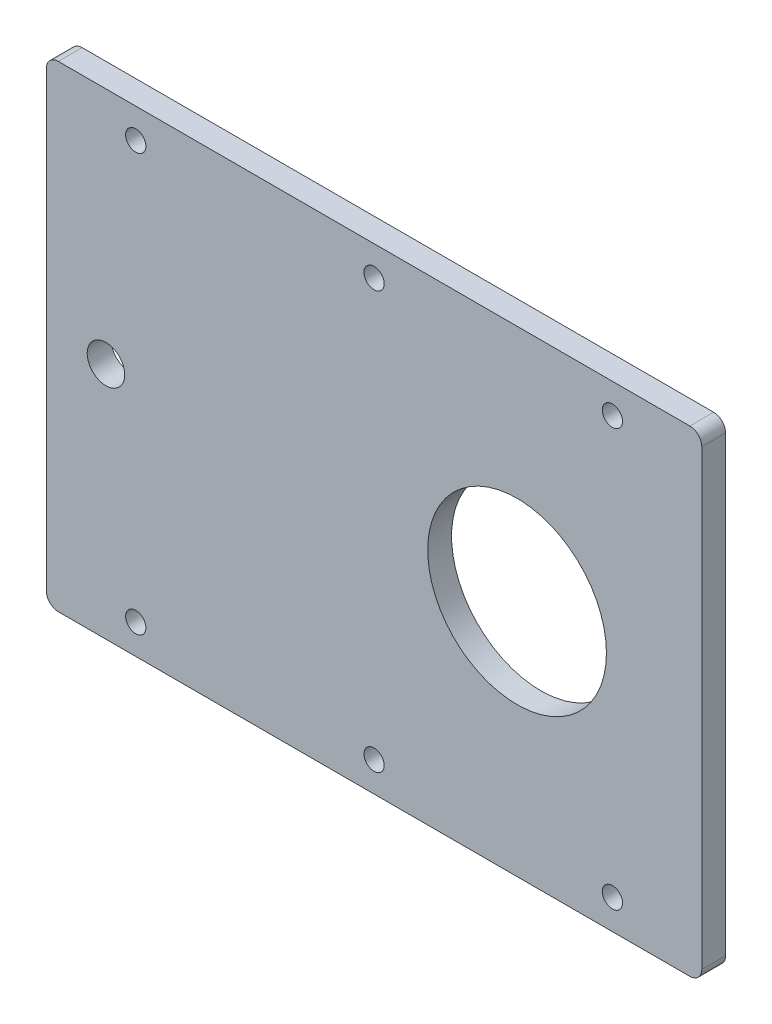
ISO-10303-21;
HEADER;
FILE_DESCRIPTION(('STEP AP214'),'2;1');
FILE_NAME('part.step','',(''),(''),'','','');
FILE_SCHEMA(('AUTOMOTIVE_DESIGN { 1 0 10303 214 1 1 1 1 }'));
ENDSEC;
DATA;
#1=APPLICATION_CONTEXT('core data for automotive mechanical design processes');
#2=APPLICATION_PROTOCOL_DEFINITION('international standard','automotive_design',2000,#1);
#3=PRODUCT_CONTEXT('',#1,'mechanical');
#4=PRODUCT('Part','Part','',(#3));
#5=PRODUCT_RELATED_PRODUCT_CATEGORY('part','',(#4));
#6=PRODUCT_DEFINITION_FORMATION('','',#4);
#7=PRODUCT_DEFINITION_CONTEXT('part definition',#1,'design');
#8=PRODUCT_DEFINITION('design','',#6,#7);
#9=PRODUCT_DEFINITION_SHAPE('','',#8);
#10=(LENGTH_UNIT() NAMED_UNIT(*) SI_UNIT(.MILLI.,.METRE.));
#11=(NAMED_UNIT(*) PLANE_ANGLE_UNIT() SI_UNIT($,.RADIAN.));
#12=(NAMED_UNIT(*) SI_UNIT($,.STERADIAN.) SOLID_ANGLE_UNIT());
#13=UNCERTAINTY_MEASURE_WITH_UNIT(LENGTH_MEASURE(1.E-05),#10,'distance_accuracy_value','');
#14=(GEOMETRIC_REPRESENTATION_CONTEXT(3) GLOBAL_UNCERTAINTY_ASSIGNED_CONTEXT((#13)) GLOBAL_UNIT_ASSIGNED_CONTEXT((#10,
#11,#12)) REPRESENTATION_CONTEXT('',''));
#15=CARTESIAN_POINT('',(0.,0.,0.));
#16=DIRECTION('',(0.,0.,1.));
#17=DIRECTION('',(1.,0.,0.));
#18=AXIS2_PLACEMENT_3D('',#15,#16,#17);
#19=CARTESIAN_POINT('',(108.890553518469,0.,4.));
#20=DIRECTION('',(1.,0.,0.));
#21=DIRECTION('',(0.,0.,-1.));
#22=AXIS2_PLACEMENT_3D('',#19,#20,#21);
#23=PLANE('',#22);
#24=DIRECTION('',(0.,-1.,0.));
#25=VECTOR('',#24,1.);
#26=CARTESIAN_POINT('',(108.890553518469,0.,4.));
#27=LINE('',#26,#25);
#28=CARTESIAN_POINT('',(108.890553518469,36.5388552235937,4.));
#29=VERTEX_POINT('',#28);
#30=CARTESIAN_POINT('',(108.890553518469,-39.4611447764063,4.));
#31=VERTEX_POINT('',#30);
#32=EDGE_CURVE('E158',#29,#31,#27,.T.);
#33=ORIENTED_EDGE('',*,*,#32,.T.);
#34=DIRECTION('',(0.,0.,-1.));
#35=VECTOR('',#34,1.);
#36=CARTESIAN_POINT('',(108.890553518469,-39.4611447764063,0.));
#37=LINE('',#36,#35);
#38=CARTESIAN_POINT('',(108.890553518469,-39.4611447764063,0.));
#39=VERTEX_POINT('',#38);
#40=EDGE_CURVE('E112',#31,#39,#37,.T.);
#41=ORIENTED_EDGE('',*,*,#40,.T.);
#42=DIRECTION('',(0.,-1.,0.));
#43=VECTOR('',#42,1.);
#44=CARTESIAN_POINT('',(108.890553518469,0.,0.));
#45=LINE('',#44,#43);
#46=CARTESIAN_POINT('',(108.890553518469,36.5388552235937,0.));
#47=VERTEX_POINT('',#46);
#48=EDGE_CURVE('E104',#47,#39,#45,.T.);
#49=ORIENTED_EDGE('',*,*,#48,.F.);
#50=DIRECTION('',(0.,0.,-1.));
#51=VECTOR('',#50,1.);
#52=CARTESIAN_POINT('',(108.890553518469,36.5388552235937,4.));
#53=LINE('',#52,#51);
#54=EDGE_CURVE('E117',#47,#29,#53,.F.);
#55=ORIENTED_EDGE('',*,*,#54,.T.);
#56=EDGE_LOOP('',(#33,#41,#49,#55));
#57=FACE_BOUND('',#56,.T.);
#58=ADVANCED_FACE('F35',(#57),#23,.T.);
#59=CARTESIAN_POINT('',(0.,38.5388552235937,4.));
#60=DIRECTION('',(0.,1.,0.));
#61=DIRECTION('',(0.,0.,1.));
#62=AXIS2_PLACEMENT_3D('',#59,#60,#61);
#63=PLANE('',#62);
#64=DIRECTION('',(1.,0.,0.));
#65=VECTOR('',#64,1.);
#66=CARTESIAN_POINT('',(0.,38.5388552235937,0.));
#67=LINE('',#66,#65);
#68=CARTESIAN_POINT('',(0.890553518468655,38.5388552235937,0.));
#69=VERTEX_POINT('',#68);
#70=CARTESIAN_POINT('',(106.890553518469,38.5388552235937,0.));
#71=VERTEX_POINT('',#70);
#72=EDGE_CURVE('E106',#69,#71,#67,.T.);
#73=ORIENTED_EDGE('',*,*,#72,.F.);
#74=DIRECTION('',(0.,0.,-1.));
#75=VECTOR('',#74,1.);
#76=CARTESIAN_POINT('',(0.890553518468655,38.5388552235937,4.));
#77=LINE('',#76,#75);
#78=CARTESIAN_POINT('',(0.890553518468655,38.5388552235937,4.));
#79=VERTEX_POINT('',#78);
#80=EDGE_CURVE('E11',#69,#79,#77,.F.);
#81=ORIENTED_EDGE('',*,*,#80,.T.);
#82=DIRECTION('',(1.,0.,0.));
#83=VECTOR('',#82,1.);
#84=CARTESIAN_POINT('',(0.,38.5388552235937,4.));
#85=LINE('',#84,#83);
#86=CARTESIAN_POINT('',(106.890553518469,38.5388552235937,4.));
#87=VERTEX_POINT('',#86);
#88=EDGE_CURVE('E157',#79,#87,#85,.T.);
#89=ORIENTED_EDGE('',*,*,#88,.T.);
#90=DIRECTION('',(0.,0.,-1.));
#91=VECTOR('',#90,1.);
#92=CARTESIAN_POINT('',(106.890553518469,38.5388552235937,4.));
#93=LINE('',#92,#91);
#94=EDGE_CURVE('E43',#87,#71,#93,.T.);
#95=ORIENTED_EDGE('',*,*,#94,.T.);
#96=EDGE_LOOP('',(#73,#81,#89,#95));
#97=FACE_BOUND('',#96,.T.);
#98=ADVANCED_FACE('F155',(#97),#63,.T.);
#99=CARTESIAN_POINT('',(-1.10944648153134,0.,4.));
#100=DIRECTION('',(1.,0.,0.));
#101=DIRECTION('',(0.,1.,0.));
#102=AXIS2_PLACEMENT_3D('',#99,#100,#101);
#103=PLANE('',#102);
#104=DIRECTION('',(0.,-1.,0.));
#105=VECTOR('',#104,1.);
#106=CARTESIAN_POINT('',(-1.10944648153134,0.,0.));
#107=LINE('',#106,#105);
#108=CARTESIAN_POINT('',(-1.10944648153135,36.5388552235937,0.));
#109=VERTEX_POINT('',#108);
#110=CARTESIAN_POINT('',(-1.10944648153134,-39.4611447764063,0.));
#111=VERTEX_POINT('',#110);
#112=EDGE_CURVE('E188',#109,#111,#107,.T.);
#113=ORIENTED_EDGE('',*,*,#112,.T.);
#114=DIRECTION('',(0.,0.,-1.));
#115=VECTOR('',#114,1.);
#116=CARTESIAN_POINT('',(-1.10944648153134,-39.4611447764063,4.));
#117=LINE('',#116,#115);
#118=CARTESIAN_POINT('',(-1.10944648153134,-39.4611447764063,4.));
#119=VERTEX_POINT('',#118);
#120=EDGE_CURVE('E50',#111,#119,#117,.F.);
#121=ORIENTED_EDGE('',*,*,#120,.T.);
#122=DIRECTION('',(0.,-1.,0.));
#123=VECTOR('',#122,1.);
#124=CARTESIAN_POINT('',(-1.10944648153134,0.,4.));
#125=LINE('',#124,#123);
#126=CARTESIAN_POINT('',(-1.10944648153135,36.5388552235937,4.));
#127=VERTEX_POINT('',#126);
#128=EDGE_CURVE('E128',#127,#119,#125,.T.);
#129=ORIENTED_EDGE('',*,*,#128,.F.);
#130=DIRECTION('',(0.,0.,-1.));
#131=VECTOR('',#130,1.);
#132=CARTESIAN_POINT('',(-1.10944648153135,36.5388552235937,0.));
#133=LINE('',#132,#131);
#134=EDGE_CURVE('E150',#127,#109,#133,.T.);
#135=ORIENTED_EDGE('',*,*,#134,.T.);
#136=EDGE_LOOP('',(#113,#121,#129,#135));
#137=FACE_BOUND('',#136,.T.);
#138=ADVANCED_FACE('F251',(#137),#103,.F.);
#139=CARTESIAN_POINT('',(13.8905535184686,33.5388552235937,4.));
#140=DIRECTION('',(0.,0.,-1.));
#141=DIRECTION('',(-1.,0.,0.));
#142=AXIS2_PLACEMENT_3D('',#139,#140,#141);
#143=CYLINDRICAL_SURFACE('',#142,1.7);
#144=CARTESIAN_POINT('',(13.8905535184686,33.5388552235937,4.));
#145=DIRECTION('',(0.,0.,1.));
#146=DIRECTION('',(1.,0.,0.));
#147=AXIS2_PLACEMENT_3D('',#144,#145,#146);
#148=CIRCLE('',#147,1.7);
#149=CARTESIAN_POINT('',(15.5905535184686,33.5388552235937,4.));
#150=VERTEX_POINT('',#149);
#151=EDGE_CURVE('E161',#150,#150,#148,.T.);
#152=ORIENTED_EDGE('',*,*,#151,.T.);
#153=EDGE_LOOP('',(#152));
#154=FACE_BOUND('',#153,.T.);
#155=CARTESIAN_POINT('',(13.8905535184686,33.5388552235937,0.));
#156=DIRECTION('',(0.,0.,1.));
#157=DIRECTION('',(1.,0.,0.));
#158=AXIS2_PLACEMENT_3D('',#155,#156,#157);
#159=CIRCLE('',#158,1.7);
#160=CARTESIAN_POINT('',(15.5905535184686,33.5388552235937,0.));
#161=VERTEX_POINT('',#160);
#162=EDGE_CURVE('E120',#161,#161,#159,.T.);
#163=ORIENTED_EDGE('',*,*,#162,.F.);
#164=EDGE_LOOP('',(#163));
#165=FACE_BOUND('',#164,.T.);
#166=ADVANCED_FACE('F220',(#154,#165),#143,.F.);
#167=CARTESIAN_POINT('',(93.8905535184687,33.5388552235937,4.));
#168=DIRECTION('',(0.,0.,-1.));
#169=DIRECTION('',(-1.,0.,0.));
#170=AXIS2_PLACEMENT_3D('',#167,#168,#169);
#171=CYLINDRICAL_SURFACE('',#170,1.7);
#172=CARTESIAN_POINT('',(93.8905535184687,33.5388552235937,4.));
#173=DIRECTION('',(0.,0.,1.));
#174=DIRECTION('',(1.,0.,0.));
#175=AXIS2_PLACEMENT_3D('',#172,#173,#174);
#176=CIRCLE('',#175,1.7);
#177=CARTESIAN_POINT('',(95.5905535184687,33.5388552235937,4.));
#178=VERTEX_POINT('',#177);
#179=EDGE_CURVE('E215',#178,#178,#176,.T.);
#180=ORIENTED_EDGE('',*,*,#179,.T.);
#181=EDGE_LOOP('',(#180));
#182=FACE_BOUND('',#181,.T.);
#183=CARTESIAN_POINT('',(93.8905535184687,33.5388552235937,0.));
#184=DIRECTION('',(0.,0.,1.));
#185=DIRECTION('',(1.,0.,0.));
#186=AXIS2_PLACEMENT_3D('',#183,#184,#185);
#187=CIRCLE('',#186,1.7);
#188=CARTESIAN_POINT('',(95.5905535184687,33.5388552235937,0.));
#189=VERTEX_POINT('',#188);
#190=EDGE_CURVE('E183',#189,#189,#187,.T.);
#191=ORIENTED_EDGE('',*,*,#190,.F.);
#192=EDGE_LOOP('',(#191));
#193=FACE_BOUND('',#192,.T.);
#194=ADVANCED_FACE('F256',(#182,#193),#171,.F.);
#195=CARTESIAN_POINT('',(53.8905535184686,33.5388552235937,4.));
#196=DIRECTION('',(0.,0.,-1.));
#197=DIRECTION('',(-1.,0.,0.));
#198=AXIS2_PLACEMENT_3D('',#195,#196,#197);
#199=CYLINDRICAL_SURFACE('',#198,1.7);
#200=CARTESIAN_POINT('',(53.8905535184686,33.5388552235937,4.));
#201=DIRECTION('',(0.,0.,1.));
#202=DIRECTION('',(1.,0.,0.));
#203=AXIS2_PLACEMENT_3D('',#200,#201,#202);
#204=CIRCLE('',#203,1.7);
#205=CARTESIAN_POINT('',(55.5905535184686,33.5388552235937,4.));
#206=VERTEX_POINT('',#205);
#207=EDGE_CURVE('E212',#206,#206,#204,.T.);
#208=ORIENTED_EDGE('',*,*,#207,.T.);
#209=EDGE_LOOP('',(#208));
#210=FACE_BOUND('',#209,.T.);
#211=CARTESIAN_POINT('',(53.8905535184686,33.5388552235937,0.));
#212=DIRECTION('',(0.,0.,1.));
#213=DIRECTION('',(1.,0.,0.));
#214=AXIS2_PLACEMENT_3D('',#211,#212,#213);
#215=CIRCLE('',#214,1.7);
#216=CARTESIAN_POINT('',(55.5905535184686,33.5388552235937,0.));
#217=VERTEX_POINT('',#216);
#218=EDGE_CURVE('E180',#217,#217,#215,.T.);
#219=ORIENTED_EDGE('',*,*,#218,.F.);
#220=EDGE_LOOP('',(#219));
#221=FACE_BOUND('',#220,.T.);
#222=ADVANCED_FACE('F259',(#210,#221),#199,.F.);
#223=CARTESIAN_POINT('',(13.8905535184686,-36.4611447764063,4.));
#224=DIRECTION('',(0.,0.,-1.));
#225=DIRECTION('',(-1.,0.,0.));
#226=AXIS2_PLACEMENT_3D('',#223,#224,#225);
#227=CYLINDRICAL_SURFACE('',#226,1.7);
#228=CARTESIAN_POINT('',(13.8905535184686,-36.4611447764063,4.));
#229=DIRECTION('',(0.,0.,1.));
#230=DIRECTION('',(1.,0.,0.));
#231=AXIS2_PLACEMENT_3D('',#228,#229,#230);
#232=CIRCLE('',#231,1.7);
#233=CARTESIAN_POINT('',(15.5905535184686,-36.4611447764063,4.));
#234=VERTEX_POINT('',#233);
#235=EDGE_CURVE('E209',#234,#234,#232,.T.);
#236=ORIENTED_EDGE('',*,*,#235,.T.);
#237=EDGE_LOOP('',(#236));
#238=FACE_BOUND('',#237,.T.);
#239=CARTESIAN_POINT('',(13.8905535184686,-36.4611447764063,0.));
#240=DIRECTION('',(0.,0.,1.));
#241=DIRECTION('',(1.,0.,0.));
#242=AXIS2_PLACEMENT_3D('',#239,#240,#241);
#243=CIRCLE('',#242,1.7);
#244=CARTESIAN_POINT('',(15.5905535184686,-36.4611447764063,0.));
#245=VERTEX_POINT('',#244);
#246=EDGE_CURVE('E177',#245,#245,#243,.T.);
#247=ORIENTED_EDGE('',*,*,#246,.F.);
#248=EDGE_LOOP('',(#247));
#249=FACE_BOUND('',#248,.T.);
#250=ADVANCED_FACE('F263',(#238,#249),#227,.F.);
#251=CARTESIAN_POINT('',(53.8905535184686,-36.4611447764063,4.));
#252=DIRECTION('',(0.,0.,-1.));
#253=DIRECTION('',(-1.,0.,0.));
#254=AXIS2_PLACEMENT_3D('',#251,#252,#253);
#255=CYLINDRICAL_SURFACE('',#254,1.7);
#256=CARTESIAN_POINT('',(53.8905535184686,-36.4611447764063,4.));
#257=DIRECTION('',(0.,0.,1.));
#258=DIRECTION('',(1.,0.,0.));
#259=AXIS2_PLACEMENT_3D('',#256,#257,#258);
#260=CIRCLE('',#259,1.7);
#261=CARTESIAN_POINT('',(55.5905535184686,-36.4611447764063,4.));
#262=VERTEX_POINT('',#261);
#263=EDGE_CURVE('E206',#262,#262,#260,.T.);
#264=ORIENTED_EDGE('',*,*,#263,.T.);
#265=EDGE_LOOP('',(#264));
#266=FACE_BOUND('',#265,.T.);
#267=CARTESIAN_POINT('',(53.8905535184686,-36.4611447764063,0.));
#268=DIRECTION('',(0.,0.,1.));
#269=DIRECTION('',(1.,0.,0.));
#270=AXIS2_PLACEMENT_3D('',#267,#268,#269);
#271=CIRCLE('',#270,1.7);
#272=CARTESIAN_POINT('',(55.5905535184686,-36.4611447764063,0.));
#273=VERTEX_POINT('',#272);
#274=EDGE_CURVE('E174',#273,#273,#271,.T.);
#275=ORIENTED_EDGE('',*,*,#274,.F.);
#276=EDGE_LOOP('',(#275));
#277=FACE_BOUND('',#276,.T.);
#278=ADVANCED_FACE('F267',(#266,#277),#255,.F.);
#279=CARTESIAN_POINT('',(93.8905535184686,-36.4611447764063,4.));
#280=DIRECTION('',(0.,0.,-1.));
#281=DIRECTION('',(-1.,0.,0.));
#282=AXIS2_PLACEMENT_3D('',#279,#280,#281);
#283=CYLINDRICAL_SURFACE('',#282,1.7);
#284=CARTESIAN_POINT('',(93.8905535184686,-36.4611447764063,4.));
#285=DIRECTION('',(0.,0.,1.));
#286=DIRECTION('',(1.,0.,0.));
#287=AXIS2_PLACEMENT_3D('',#284,#285,#286);
#288=CIRCLE('',#287,1.7);
#289=CARTESIAN_POINT('',(95.5905535184686,-36.4611447764063,4.));
#290=VERTEX_POINT('',#289);
#291=EDGE_CURVE('E201',#290,#290,#288,.T.);
#292=ORIENTED_EDGE('',*,*,#291,.T.);
#293=EDGE_LOOP('',(#292));
#294=FACE_BOUND('',#293,.T.);
#295=CARTESIAN_POINT('',(93.8905535184686,-36.4611447764063,0.));
#296=DIRECTION('',(0.,0.,1.));
#297=DIRECTION('',(1.,0.,0.));
#298=AXIS2_PLACEMENT_3D('',#295,#296,#297);
#299=CIRCLE('',#298,1.7);
#300=CARTESIAN_POINT('',(95.5905535184686,-36.4611447764063,0.));
#301=VERTEX_POINT('',#300);
#302=EDGE_CURVE('E171',#301,#301,#299,.T.);
#303=ORIENTED_EDGE('',*,*,#302,.F.);
#304=EDGE_LOOP('',(#303));
#305=FACE_BOUND('',#304,.T.);
#306=ADVANCED_FACE('F271',(#294,#305),#283,.F.);
#307=CARTESIAN_POINT('',(8.89055351846864,-1.46114477640627,4.));
#308=DIRECTION('',(0.,0.,-1.));
#309=DIRECTION('',(-1.,0.,0.));
#310=AXIS2_PLACEMENT_3D('',#307,#308,#309);
#311=CYLINDRICAL_SURFACE('',#310,3.15);
#312=CARTESIAN_POINT('',(8.89055351846864,-1.46114477640627,4.));
#313=DIRECTION('',(0.,0.,1.));
#314=DIRECTION('',(1.,0.,0.));
#315=AXIS2_PLACEMENT_3D('',#312,#313,#314);
#316=CIRCLE('',#315,3.15);
#317=CARTESIAN_POINT('',(12.0405535184686,-1.46114477640627,4.));
#318=VERTEX_POINT('',#317);
#319=EDGE_CURVE('E196',#318,#318,#316,.T.);
#320=ORIENTED_EDGE('',*,*,#319,.T.);
#321=EDGE_LOOP('',(#320));
#322=FACE_BOUND('',#321,.T.);
#323=CARTESIAN_POINT('',(8.89055351846864,-1.46114477640627,0.));
#324=DIRECTION('',(0.,0.,1.));
#325=DIRECTION('',(1.,0.,0.));
#326=AXIS2_PLACEMENT_3D('',#323,#324,#325);
#327=CIRCLE('',#326,3.15);
#328=CARTESIAN_POINT('',(12.0405535184686,-1.46114477640627,0.));
#329=VERTEX_POINT('',#328);
#330=EDGE_CURVE('E168',#329,#329,#327,.T.);
#331=ORIENTED_EDGE('',*,*,#330,.F.);
#332=EDGE_LOOP('',(#331));
#333=FACE_BOUND('',#332,.T.);
#334=ADVANCED_FACE('F242',(#322,#333),#311,.F.);
#335=CARTESIAN_POINT('',(77.8905535184686,-1.46114477640626,4.));
#336=DIRECTION('',(0.,0.,-1.));
#337=DIRECTION('',(-1.,0.,0.));
#338=AXIS2_PLACEMENT_3D('',#335,#336,#337);
#339=CYLINDRICAL_SURFACE('',#338,15.);
#340=CARTESIAN_POINT('',(77.8905535184686,-1.46114477640626,4.));
#341=DIRECTION('',(0.,0.,1.));
#342=DIRECTION('',(1.,0.,0.));
#343=AXIS2_PLACEMENT_3D('',#340,#341,#342);
#344=CIRCLE('',#343,15.);
#345=CARTESIAN_POINT('',(92.8905535184686,-1.46114477640626,4.));
#346=VERTEX_POINT('',#345);
#347=EDGE_CURVE('E191',#346,#346,#344,.T.);
#348=ORIENTED_EDGE('',*,*,#347,.T.);
#349=EDGE_LOOP('',(#348));
#350=FACE_BOUND('',#349,.T.);
#351=CARTESIAN_POINT('',(77.8905535184686,-1.46114477640626,0.));
#352=DIRECTION('',(0.,0.,1.));
#353=DIRECTION('',(1.,0.,0.));
#354=AXIS2_PLACEMENT_3D('',#351,#352,#353);
#355=CIRCLE('',#354,15.);
#356=CARTESIAN_POINT('',(92.8905535184686,-1.46114477640626,0.));
#357=VERTEX_POINT('',#356);
#358=EDGE_CURVE('E165',#357,#357,#355,.T.);
#359=ORIENTED_EDGE('',*,*,#358,.F.);
#360=EDGE_LOOP('',(#359));
#361=FACE_BOUND('',#360,.T.);
#362=ADVANCED_FACE('F237',(#350,#361),#339,.F.);
#363=CARTESIAN_POINT('',(0.,-41.4611447764063,4.));
#364=DIRECTION('',(0.,1.,0.));
#365=DIRECTION('',(0.,0.,1.));
#366=AXIS2_PLACEMENT_3D('',#363,#364,#365);
#367=PLANE('',#366);
#368=DIRECTION('',(1.,0.,0.));
#369=VECTOR('',#368,1.);
#370=CARTESIAN_POINT('',(0.,-41.4611447764063,0.));
#371=LINE('',#370,#369);
#372=CARTESIAN_POINT('',(0.890553518468664,-41.4611447764063,0.));
#373=VERTEX_POINT('',#372);
#374=CARTESIAN_POINT('',(106.890553518469,-41.4611447764063,0.));
#375=VERTEX_POINT('',#374);
#376=EDGE_CURVE('E131',#373,#375,#371,.T.);
#377=ORIENTED_EDGE('',*,*,#376,.T.);
#378=DIRECTION('',(0.,0.,-1.));
#379=VECTOR('',#378,1.);
#380=CARTESIAN_POINT('',(106.890553518469,-41.4611447764063,4.));
#381=LINE('',#380,#379);
#382=CARTESIAN_POINT('',(106.890553518469,-41.4611447764063,4.));
#383=VERTEX_POINT('',#382);
#384=EDGE_CURVE('E142',#375,#383,#381,.F.);
#385=ORIENTED_EDGE('',*,*,#384,.T.);
#386=DIRECTION('',(1.,0.,0.));
#387=VECTOR('',#386,1.);
#388=CARTESIAN_POINT('',(0.,-41.4611447764063,4.));
#389=LINE('',#388,#387);
#390=CARTESIAN_POINT('',(0.890553518468664,-41.4611447764063,4.));
#391=VERTEX_POINT('',#390);
#392=EDGE_CURVE('E124',#391,#383,#389,.T.);
#393=ORIENTED_EDGE('',*,*,#392,.F.);
#394=DIRECTION('',(0.,0.,-1.));
#395=VECTOR('',#394,1.);
#396=CARTESIAN_POINT('',(0.890553518468664,-41.4611447764063,4.));
#397=LINE('',#396,#395);
#398=EDGE_CURVE('E139',#391,#373,#397,.T.);
#399=ORIENTED_EDGE('',*,*,#398,.T.);
#400=EDGE_LOOP('',(#377,#385,#393,#399));
#401=FACE_BOUND('',#400,.T.);
#402=ADVANCED_FACE('F225',(#401),#367,.F.);
#403=CARTESIAN_POINT('',(0.,0.,4.));
#404=DIRECTION('',(0.,0.,1.));
#405=DIRECTION('',(1.,0.,0.));
#406=AXIS2_PLACEMENT_3D('',#403,#404,#405);
#407=PLANE('',#406);
#408=ORIENTED_EDGE('',*,*,#347,.F.);
#409=EDGE_LOOP('',(#408));
#410=FACE_BOUND('',#409,.T.);
#411=ORIENTED_EDGE('',*,*,#319,.F.);
#412=EDGE_LOOP('',(#411));
#413=FACE_BOUND('',#412,.T.);
#414=ORIENTED_EDGE('',*,*,#291,.F.);
#415=EDGE_LOOP('',(#414));
#416=FACE_BOUND('',#415,.T.);
#417=ORIENTED_EDGE('',*,*,#263,.F.);
#418=EDGE_LOOP('',(#417));
#419=FACE_BOUND('',#418,.T.);
#420=ORIENTED_EDGE('',*,*,#235,.F.);
#421=EDGE_LOOP('',(#420));
#422=FACE_BOUND('',#421,.T.);
#423=ORIENTED_EDGE('',*,*,#207,.F.);
#424=EDGE_LOOP('',(#423));
#425=FACE_BOUND('',#424,.T.);
#426=ORIENTED_EDGE('',*,*,#179,.F.);
#427=EDGE_LOOP('',(#426));
#428=FACE_BOUND('',#427,.T.);
#429=ORIENTED_EDGE('',*,*,#151,.F.);
#430=EDGE_LOOP('',(#429));
#431=FACE_BOUND('',#430,.T.);
#432=ORIENTED_EDGE('',*,*,#392,.T.);
#433=CARTESIAN_POINT('',(106.890553518469,-39.4611447764063,4.));
#434=DIRECTION('',(0.,0.,1.));
#435=DIRECTION('',(1.,0.,0.));
#436=AXIS2_PLACEMENT_3D('',#433,#434,#435);
#437=CIRCLE('',#436,2.);
#438=EDGE_CURVE('E148',#383,#31,#437,.T.);
#439=ORIENTED_EDGE('',*,*,#438,.T.);
#440=ORIENTED_EDGE('',*,*,#32,.F.);
#441=CARTESIAN_POINT('',(106.890553518469,36.5388552235937,4.));
#442=DIRECTION('',(0.,0.,1.));
#443=DIRECTION('',(1.,0.,0.));
#444=AXIS2_PLACEMENT_3D('',#441,#442,#443);
#445=CIRCLE('',#444,2.);
#446=EDGE_CURVE('E123',#29,#87,#445,.T.);
#447=ORIENTED_EDGE('',*,*,#446,.T.);
#448=ORIENTED_EDGE('',*,*,#88,.F.);
#449=CARTESIAN_POINT('',(0.890553518468655,36.5388552235937,4.));
#450=DIRECTION('',(0.,0.,1.));
#451=DIRECTION('',(1.,0.,0.));
#452=AXIS2_PLACEMENT_3D('',#449,#450,#451);
#453=CIRCLE('',#452,2.);
#454=EDGE_CURVE('E57',#79,#127,#453,.T.);
#455=ORIENTED_EDGE('',*,*,#454,.T.);
#456=ORIENTED_EDGE('',*,*,#128,.T.);
#457=CARTESIAN_POINT('',(0.890553518468664,-39.4611447764063,4.));
#458=DIRECTION('',(0.,0.,1.));
#459=DIRECTION('',(1.,0.,0.));
#460=AXIS2_PLACEMENT_3D('',#457,#458,#459);
#461=CIRCLE('',#460,2.);
#462=EDGE_CURVE('E146',#119,#391,#461,.T.);
#463=ORIENTED_EDGE('',*,*,#462,.T.);
#464=EDGE_LOOP('',(#432,#439,#440,#447,#448,#455,#456,#463));
#465=FACE_BOUND('',#464,.T.);
#466=ADVANCED_FACE('F223',(#410,#413,#416,#419,#422,#425,#428,#431,#465),#407,.T.);
#467=CARTESIAN_POINT('',(0.,0.,0.));
#468=DIRECTION('',(0.,0.,1.));
#469=DIRECTION('',(1.,0.,0.));
#470=AXIS2_PLACEMENT_3D('',#467,#468,#469);
#471=PLANE('',#470);
#472=ORIENTED_EDGE('',*,*,#358,.T.);
#473=EDGE_LOOP('',(#472));
#474=FACE_BOUND('',#473,.T.);
#475=ORIENTED_EDGE('',*,*,#330,.T.);
#476=EDGE_LOOP('',(#475));
#477=FACE_BOUND('',#476,.T.);
#478=ORIENTED_EDGE('',*,*,#302,.T.);
#479=EDGE_LOOP('',(#478));
#480=FACE_BOUND('',#479,.T.);
#481=ORIENTED_EDGE('',*,*,#274,.T.);
#482=EDGE_LOOP('',(#481));
#483=FACE_BOUND('',#482,.T.);
#484=ORIENTED_EDGE('',*,*,#246,.T.);
#485=EDGE_LOOP('',(#484));
#486=FACE_BOUND('',#485,.T.);
#487=ORIENTED_EDGE('',*,*,#218,.T.);
#488=EDGE_LOOP('',(#487));
#489=FACE_BOUND('',#488,.T.);
#490=ORIENTED_EDGE('',*,*,#190,.T.);
#491=EDGE_LOOP('',(#490));
#492=FACE_BOUND('',#491,.T.);
#493=ORIENTED_EDGE('',*,*,#162,.T.);
#494=EDGE_LOOP('',(#493));
#495=FACE_BOUND('',#494,.T.);
#496=ORIENTED_EDGE('',*,*,#48,.T.);
#497=CARTESIAN_POINT('',(106.890553518469,-39.4611447764063,0.));
#498=DIRECTION('',(0.,0.,1.));
#499=DIRECTION('',(1.,0.,0.));
#500=AXIS2_PLACEMENT_3D('',#497,#498,#499);
#501=CIRCLE('',#500,2.);
#502=EDGE_CURVE('E137',#39,#375,#501,.F.);
#503=ORIENTED_EDGE('',*,*,#502,.T.);
#504=ORIENTED_EDGE('',*,*,#376,.F.);
#505=CARTESIAN_POINT('',(0.890553518468664,-39.4611447764063,0.));
#506=DIRECTION('',(0.,0.,1.));
#507=DIRECTION('',(1.,0.,0.));
#508=AXIS2_PLACEMENT_3D('',#505,#506,#507);
#509=CIRCLE('',#508,2.);
#510=EDGE_CURVE('E135',#373,#111,#509,.F.);
#511=ORIENTED_EDGE('',*,*,#510,.T.);
#512=ORIENTED_EDGE('',*,*,#112,.F.);
#513=CARTESIAN_POINT('',(0.890553518468655,36.5388552235937,0.));
#514=DIRECTION('',(0.,0.,1.));
#515=DIRECTION('',(1.,0.,0.));
#516=AXIS2_PLACEMENT_3D('',#513,#514,#515);
#517=CIRCLE('',#516,2.);
#518=EDGE_CURVE('E111',#109,#69,#517,.F.);
#519=ORIENTED_EDGE('',*,*,#518,.T.);
#520=ORIENTED_EDGE('',*,*,#72,.T.);
#521=CARTESIAN_POINT('',(106.890553518469,36.5388552235937,0.));
#522=DIRECTION('',(0.,0.,1.));
#523=DIRECTION('',(1.,0.,0.));
#524=AXIS2_PLACEMENT_3D('',#521,#522,#523);
#525=CIRCLE('',#524,2.);
#526=EDGE_CURVE('E101',#71,#47,#525,.F.);
#527=ORIENTED_EDGE('',*,*,#526,.T.);
#528=EDGE_LOOP('',(#496,#503,#504,#511,#512,#519,#520,#527));
#529=FACE_BOUND('',#528,.T.);
#530=ADVANCED_FACE('F103',(#474,#477,#480,#483,#486,#489,#492,#495,#529),#471,.F.);
#531=CARTESIAN_POINT('',(106.890553518469,-39.4611447764063,4.));
#532=DIRECTION('',(0.,0.,1.));
#533=DIRECTION('',(1.,0.,0.));
#534=AXIS2_PLACEMENT_3D('',#531,#532,#533);
#535=CYLINDRICAL_SURFACE('',#534,2.);
#536=ORIENTED_EDGE('',*,*,#438,.F.);
#537=ORIENTED_EDGE('',*,*,#384,.F.);
#538=ORIENTED_EDGE('',*,*,#502,.F.);
#539=ORIENTED_EDGE('',*,*,#40,.F.);
#540=EDGE_LOOP('',(#536,#537,#538,#539));
#541=FACE_BOUND('',#540,.T.);
#542=ADVANCED_FACE('F233',(#541),#535,.T.);
#543=CARTESIAN_POINT('',(0.890553518468664,-39.4611447764063,4.));
#544=DIRECTION('',(0.,0.,-1.));
#545=DIRECTION('',(-1.,0.,0.));
#546=AXIS2_PLACEMENT_3D('',#543,#544,#545);
#547=CYLINDRICAL_SURFACE('',#546,2.);
#548=ORIENTED_EDGE('',*,*,#462,.F.);
#549=ORIENTED_EDGE('',*,*,#120,.F.);
#550=ORIENTED_EDGE('',*,*,#510,.F.);
#551=ORIENTED_EDGE('',*,*,#398,.F.);
#552=EDGE_LOOP('',(#548,#549,#550,#551));
#553=FACE_BOUND('',#552,.T.);
#554=ADVANCED_FACE('F235',(#553),#547,.T.);
#555=CARTESIAN_POINT('',(0.890553518468655,36.5388552235937,4.));
#556=DIRECTION('',(0.,0.,1.));
#557=DIRECTION('',(1.,0.,0.));
#558=AXIS2_PLACEMENT_3D('',#555,#556,#557);
#559=CYLINDRICAL_SURFACE('',#558,2.);
#560=ORIENTED_EDGE('',*,*,#454,.F.);
#561=ORIENTED_EDGE('',*,*,#80,.F.);
#562=ORIENTED_EDGE('',*,*,#518,.F.);
#563=ORIENTED_EDGE('',*,*,#134,.F.);
#564=EDGE_LOOP('',(#560,#561,#562,#563));
#565=FACE_BOUND('',#564,.T.);
#566=ADVANCED_FACE('F282',(#565),#559,.T.);
#567=CARTESIAN_POINT('',(106.890553518469,36.5388552235937,4.));
#568=DIRECTION('',(0.,0.,-1.));
#569=DIRECTION('',(-1.,0.,0.));
#570=AXIS2_PLACEMENT_3D('',#567,#568,#569);
#571=CYLINDRICAL_SURFACE('',#570,2.);
#572=ORIENTED_EDGE('',*,*,#446,.F.);
#573=ORIENTED_EDGE('',*,*,#54,.F.);
#574=ORIENTED_EDGE('',*,*,#526,.F.);
#575=ORIENTED_EDGE('',*,*,#94,.F.);
#576=EDGE_LOOP('',(#572,#573,#574,#575));
#577=FACE_BOUND('',#576,.T.);
#578=ADVANCED_FACE('F37',(#577),#571,.T.);
#579=CLOSED_SHELL('',(#58,#98,#138,#166,#194,#222,#250,#278,#306,#334,#362,#402,#466,#530,#542,
#554,#566,#578));
#580=MANIFOLD_SOLID_BREP('B2',#579);
#581=ADVANCED_BREP_SHAPE_REPRESENTATION('',(#18,#580),#14);
#582=SHAPE_DEFINITION_REPRESENTATION(#9,#581);
ENDSEC;
END-ISO-10303-21;
